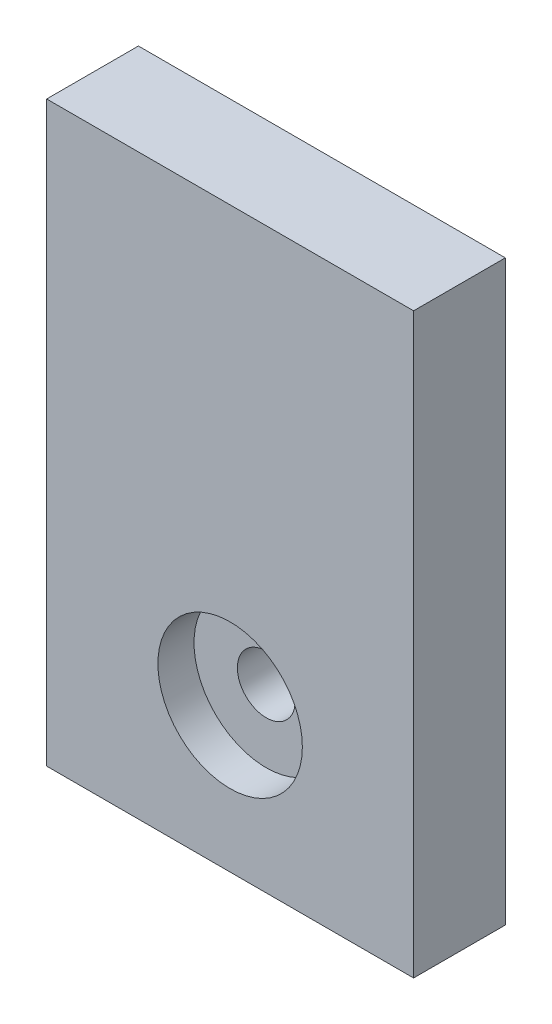
ISO-10303-21;
HEADER;
FILE_DESCRIPTION(('STEP AP214'),'2;1');
FILE_NAME('part.step','',(''),(''),'','','');
FILE_SCHEMA(('AUTOMOTIVE_DESIGN { 1 0 10303 214 1 1 1 1 }'));
ENDSEC;
DATA;
#1=APPLICATION_CONTEXT('core data for automotive mechanical design processes');
#2=APPLICATION_PROTOCOL_DEFINITION('international standard','automotive_design',2000,#1);
#3=PRODUCT_CONTEXT('',#1,'mechanical');
#4=PRODUCT('Part','Part','',(#3));
#5=PRODUCT_RELATED_PRODUCT_CATEGORY('part','',(#4));
#6=PRODUCT_DEFINITION_FORMATION('','',#4);
#7=PRODUCT_DEFINITION_CONTEXT('part definition',#1,'design');
#8=PRODUCT_DEFINITION('design','',#6,#7);
#9=PRODUCT_DEFINITION_SHAPE('','',#8);
#10=(LENGTH_UNIT() NAMED_UNIT(*) SI_UNIT(.MILLI.,.METRE.));
#11=(NAMED_UNIT(*) PLANE_ANGLE_UNIT() SI_UNIT($,.RADIAN.));
#12=(NAMED_UNIT(*) SI_UNIT($,.STERADIAN.) SOLID_ANGLE_UNIT());
#13=UNCERTAINTY_MEASURE_WITH_UNIT(LENGTH_MEASURE(1.E-05),#10,'distance_accuracy_value','');
#14=(GEOMETRIC_REPRESENTATION_CONTEXT(3) GLOBAL_UNCERTAINTY_ASSIGNED_CONTEXT((#13)) GLOBAL_UNIT_ASSIGNED_CONTEXT((#10,
#11,#12)) REPRESENTATION_CONTEXT('',''));
#15=CARTESIAN_POINT('',(0.,0.,0.));
#16=DIRECTION('',(0.,0.,1.));
#17=DIRECTION('',(1.,0.,0.));
#18=AXIS2_PLACEMENT_3D('',#15,#16,#17);
#19=CARTESIAN_POINT('',(0.,-20.,12.7));
#20=DIRECTION('',(0.,0.,-1.));
#21=DIRECTION('',(-1.,0.,0.));
#22=AXIS2_PLACEMENT_3D('',#19,#20,#21);
#23=CYLINDRICAL_SURFACE('',#22,4.);
#24=CARTESIAN_POINT('',(0.,-20.,0.));
#25=DIRECTION('',(0.,0.,1.));
#26=DIRECTION('',(1.,0.,0.));
#27=AXIS2_PLACEMENT_3D('',#24,#25,#26);
#28=CIRCLE('',#27,4.);
#29=CARTESIAN_POINT('',(4.,-20.,0.));
#30=VERTEX_POINT('',#29);
#31=EDGE_CURVE('E101',#30,#30,#28,.T.);
#32=ORIENTED_EDGE('',*,*,#31,.F.);
#33=EDGE_LOOP('',(#32));
#34=FACE_BOUND('',#33,.T.);
#35=CARTESIAN_POINT('',(0.,-20.,7.7));
#36=DIRECTION('',(0.,0.,1.));
#37=DIRECTION('',(1.,0.,0.));
#38=AXIS2_PLACEMENT_3D('',#35,#36,#37);
#39=CIRCLE('',#38,4.);
#40=CARTESIAN_POINT('',(4.,-20.,7.7));
#41=VERTEX_POINT('',#40);
#42=EDGE_CURVE('E36',#41,#41,#39,.T.);
#43=ORIENTED_EDGE('',*,*,#42,.T.);
#44=EDGE_LOOP('',(#43));
#45=FACE_BOUND('',#44,.T.);
#46=ADVANCED_FACE('F32',(#34,#45),#23,.F.);
#47=CARTESIAN_POINT('',(0.,0.,12.7));
#48=DIRECTION('',(0.,0.,1.));
#49=DIRECTION('',(1.,0.,0.));
#50=AXIS2_PLACEMENT_3D('',#47,#48,#49);
#51=PLANE('',#50);
#52=CARTESIAN_POINT('',(0.,-20.,12.7));
#53=DIRECTION('',(0.,0.,1.));
#54=DIRECTION('',(1.,0.,0.));
#55=AXIS2_PLACEMENT_3D('',#52,#53,#54);
#56=CIRCLE('',#55,10.);
#57=CARTESIAN_POINT('',(10.,-20.,12.7));
#58=VERTEX_POINT('',#57);
#59=EDGE_CURVE('E115',#58,#58,#56,.T.);
#60=ORIENTED_EDGE('',*,*,#59,.F.);
#61=EDGE_LOOP('',(#60));
#62=FACE_BOUND('',#61,.T.);
#63=DIRECTION('',(0.,-1.,0.));
#64=VECTOR('',#63,1.);
#65=CARTESIAN_POINT('',(-25.4,-40.,12.7));
#66=LINE('',#65,#64);
#67=CARTESIAN_POINT('',(-25.4,40.,12.7));
#68=VERTEX_POINT('',#67);
#69=CARTESIAN_POINT('',(-25.4,-40.,12.7));
#70=VERTEX_POINT('',#69);
#71=EDGE_CURVE('E85',#68,#70,#66,.T.);
#72=ORIENTED_EDGE('',*,*,#71,.T.);
#73=DIRECTION('',(1.,0.,0.));
#74=VECTOR('',#73,1.);
#75=CARTESIAN_POINT('',(25.4,-40.,12.7));
#76=LINE('',#75,#74);
#77=CARTESIAN_POINT('',(25.4,-40.,12.7));
#78=VERTEX_POINT('',#77);
#79=EDGE_CURVE('E80',#70,#78,#76,.T.);
#80=ORIENTED_EDGE('',*,*,#79,.T.);
#81=DIRECTION('',(0.,1.,0.));
#82=VECTOR('',#81,1.);
#83=CARTESIAN_POINT('',(25.4,-40.,12.7));
#84=LINE('',#83,#82);
#85=CARTESIAN_POINT('',(25.4,40.,12.7));
#86=VERTEX_POINT('',#85);
#87=EDGE_CURVE('E83',#78,#86,#84,.T.);
#88=ORIENTED_EDGE('',*,*,#87,.T.);
#89=DIRECTION('',(-1.,0.,0.));
#90=VECTOR('',#89,1.);
#91=CARTESIAN_POINT('',(25.4,40.,12.7));
#92=LINE('',#91,#90);
#93=EDGE_CURVE('E50',#86,#68,#92,.T.);
#94=ORIENTED_EDGE('',*,*,#93,.T.);
#95=EDGE_LOOP('',(#72,#80,#88,#94));
#96=FACE_BOUND('',#95,.T.);
#97=ADVANCED_FACE('F81',(#62,#96),#51,.T.);
#98=CARTESIAN_POINT('',(0.,0.,0.));
#99=DIRECTION('',(0.,0.,1.));
#100=DIRECTION('',(1.,0.,0.));
#101=AXIS2_PLACEMENT_3D('',#98,#99,#100);
#102=PLANE('',#101);
#103=DIRECTION('',(0.,-1.,0.));
#104=VECTOR('',#103,1.);
#105=CARTESIAN_POINT('',(-25.4,-40.,0.));
#106=LINE('',#105,#104);
#107=CARTESIAN_POINT('',(-25.4,40.,0.));
#108=VERTEX_POINT('',#107);
#109=CARTESIAN_POINT('',(-25.4,-40.,0.));
#110=VERTEX_POINT('',#109);
#111=EDGE_CURVE('E98',#108,#110,#106,.T.);
#112=ORIENTED_EDGE('',*,*,#111,.F.);
#113=DIRECTION('',(-1.,0.,0.));
#114=VECTOR('',#113,1.);
#115=CARTESIAN_POINT('',(25.4,40.,0.));
#116=LINE('',#115,#114);
#117=CARTESIAN_POINT('',(25.4,40.,0.));
#118=VERTEX_POINT('',#117);
#119=EDGE_CURVE('E73',#118,#108,#116,.T.);
#120=ORIENTED_EDGE('',*,*,#119,.F.);
#121=DIRECTION('',(0.,1.,0.));
#122=VECTOR('',#121,1.);
#123=CARTESIAN_POINT('',(25.4,-40.,0.));
#124=LINE('',#123,#122);
#125=CARTESIAN_POINT('',(25.4,-40.,0.));
#126=VERTEX_POINT('',#125);
#127=EDGE_CURVE('E67',#126,#118,#124,.T.);
#128=ORIENTED_EDGE('',*,*,#127,.F.);
#129=DIRECTION('',(1.,0.,0.));
#130=VECTOR('',#129,1.);
#131=CARTESIAN_POINT('',(25.4,-40.,0.));
#132=LINE('',#131,#130);
#133=EDGE_CURVE('E89',#110,#126,#132,.T.);
#134=ORIENTED_EDGE('',*,*,#133,.F.);
#135=EDGE_LOOP('',(#112,#120,#128,#134));
#136=FACE_BOUND('',#135,.T.);
#137=ORIENTED_EDGE('',*,*,#31,.T.);
#138=EDGE_LOOP('',(#137));
#139=FACE_BOUND('',#138,.T.);
#140=ADVANCED_FACE('F109',(#136,#139),#102,.F.);
#141=CARTESIAN_POINT('',(-25.4,-40.,12.7));
#142=DIRECTION('',(1.,0.,0.));
#143=DIRECTION('',(0.,0.,-1.));
#144=AXIS2_PLACEMENT_3D('',#141,#142,#143);
#145=PLANE('',#144);
#146=ORIENTED_EDGE('',*,*,#111,.T.);
#147=DIRECTION('',(0.,0.,-1.));
#148=VECTOR('',#147,1.);
#149=CARTESIAN_POINT('',(-25.4,-40.,12.7));
#150=LINE('',#149,#148);
#151=EDGE_CURVE('E11',#70,#110,#150,.T.);
#152=ORIENTED_EDGE('',*,*,#151,.F.);
#153=ORIENTED_EDGE('',*,*,#71,.F.);
#154=DIRECTION('',(0.,0.,-1.));
#155=VECTOR('',#154,1.);
#156=CARTESIAN_POINT('',(-25.4,40.,12.7));
#157=LINE('',#156,#155);
#158=EDGE_CURVE('E94',#68,#108,#157,.T.);
#159=ORIENTED_EDGE('',*,*,#158,.T.);
#160=EDGE_LOOP('',(#146,#152,#153,#159));
#161=FACE_BOUND('',#160,.T.);
#162=ADVANCED_FACE('F34',(#161),#145,.F.);
#163=CARTESIAN_POINT('',(25.4,-40.,12.7));
#164=DIRECTION('',(0.,1.,0.));
#165=DIRECTION('',(-1.,0.,0.));
#166=AXIS2_PLACEMENT_3D('',#163,#164,#165);
#167=PLANE('',#166);
#168=ORIENTED_EDGE('',*,*,#133,.T.);
#169=DIRECTION('',(0.,0.,-1.));
#170=VECTOR('',#169,1.);
#171=CARTESIAN_POINT('',(25.4,-40.,12.7));
#172=LINE('',#171,#170);
#173=EDGE_CURVE('E42',#78,#126,#172,.T.);
#174=ORIENTED_EDGE('',*,*,#173,.F.);
#175=ORIENTED_EDGE('',*,*,#79,.F.);
#176=ORIENTED_EDGE('',*,*,#151,.T.);
#177=EDGE_LOOP('',(#168,#174,#175,#176));
#178=FACE_BOUND('',#177,.T.);
#179=ADVANCED_FACE('F88',(#178),#167,.F.);
#180=CARTESIAN_POINT('',(25.4,-40.,12.7));
#181=DIRECTION('',(-1.,0.,0.));
#182=DIRECTION('',(0.,0.,1.));
#183=AXIS2_PLACEMENT_3D('',#180,#181,#182);
#184=PLANE('',#183);
#185=ORIENTED_EDGE('',*,*,#127,.T.);
#186=DIRECTION('',(0.,0.,-1.));
#187=VECTOR('',#186,1.);
#188=CARTESIAN_POINT('',(25.4,40.,12.7));
#189=LINE('',#188,#187);
#190=EDGE_CURVE('E90',#86,#118,#189,.T.);
#191=ORIENTED_EDGE('',*,*,#190,.F.);
#192=ORIENTED_EDGE('',*,*,#87,.F.);
#193=ORIENTED_EDGE('',*,*,#173,.T.);
#194=EDGE_LOOP('',(#185,#191,#192,#193));
#195=FACE_BOUND('',#194,.T.);
#196=ADVANCED_FACE('F92',(#195),#184,.F.);
#197=CARTESIAN_POINT('',(25.4,40.,12.7));
#198=DIRECTION('',(0.,-1.,0.));
#199=DIRECTION('',(1.,0.,0.));
#200=AXIS2_PLACEMENT_3D('',#197,#198,#199);
#201=PLANE('',#200);
#202=ORIENTED_EDGE('',*,*,#119,.T.);
#203=ORIENTED_EDGE('',*,*,#158,.F.);
#204=ORIENTED_EDGE('',*,*,#93,.F.);
#205=ORIENTED_EDGE('',*,*,#190,.T.);
#206=EDGE_LOOP('',(#202,#203,#204,#205));
#207=FACE_BOUND('',#206,.T.);
#208=ADVANCED_FACE('F106',(#207),#201,.F.);
#209=CARTESIAN_POINT('',(0.,-20.,7.7));
#210=DIRECTION('',(0.,0.,1.));
#211=DIRECTION('',(1.,0.,0.));
#212=AXIS2_PLACEMENT_3D('',#209,#210,#211);
#213=CYLINDRICAL_SURFACE('',#212,10.);
#214=CARTESIAN_POINT('',(0.,-20.,7.7));
#215=DIRECTION('',(0.,0.,1.));
#216=DIRECTION('',(1.,0.,0.));
#217=AXIS2_PLACEMENT_3D('',#214,#215,#216);
#218=CIRCLE('',#217,10.);
#219=CARTESIAN_POINT('',(10.,-20.,7.7));
#220=VERTEX_POINT('',#219);
#221=EDGE_CURVE('E118',#220,#220,#218,.T.);
#222=ORIENTED_EDGE('',*,*,#221,.F.);
#223=EDGE_LOOP('',(#222));
#224=FACE_BOUND('',#223,.T.);
#225=ORIENTED_EDGE('',*,*,#59,.T.);
#226=EDGE_LOOP('',(#225));
#227=FACE_BOUND('',#226,.T.);
#228=ADVANCED_FACE('F128',(#224,#227),#213,.F.);
#229=CARTESIAN_POINT('',(0.,-20.,7.7));
#230=DIRECTION('',(0.,0.,1.));
#231=DIRECTION('',(1.,0.,0.));
#232=AXIS2_PLACEMENT_3D('',#229,#230,#231);
#233=PLANE('',#232);
#234=ORIENTED_EDGE('',*,*,#42,.F.);
#235=EDGE_LOOP('',(#234));
#236=FACE_BOUND('',#235,.T.);
#237=ORIENTED_EDGE('',*,*,#221,.T.);
#238=EDGE_LOOP('',(#237));
#239=FACE_BOUND('',#238,.T.);
#240=ADVANCED_FACE('F126',(#236,#239),#233,.T.);
#241=CLOSED_SHELL('',(#46,#97,#140,#162,#179,#196,#208,#228,#240));
#242=MANIFOLD_SOLID_BREP('B2',#241);
#243=ADVANCED_BREP_SHAPE_REPRESENTATION('',(#18,#242),#14);
#244=SHAPE_DEFINITION_REPRESENTATION(#9,#243);
ENDSEC;
END-ISO-10303-21;
